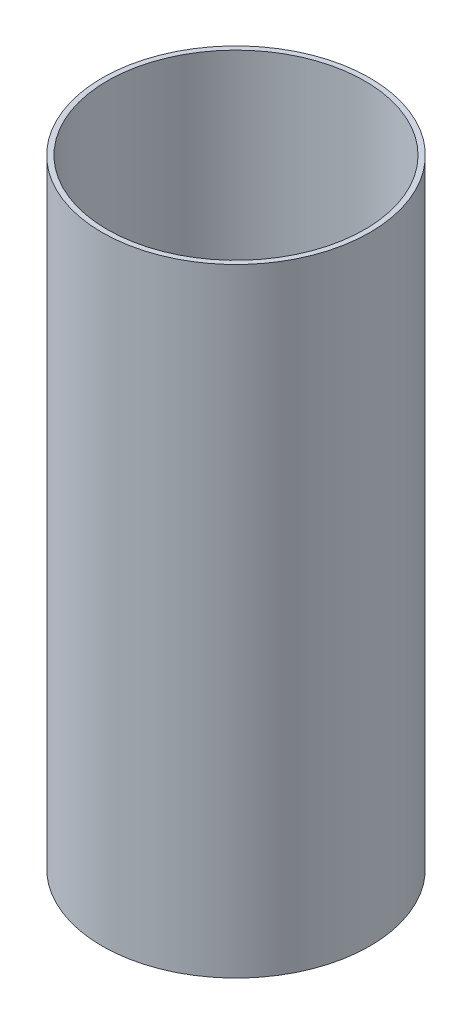
ISO-10303-21;
HEADER;
FILE_DESCRIPTION(('STEP AP214'),'2;1');
FILE_NAME('part.step','',(''),(''),'','','');
FILE_SCHEMA(('AUTOMOTIVE_DESIGN { 1 0 10303 214 1 1 1 1 }'));
ENDSEC;
DATA;
#1=APPLICATION_CONTEXT('core data for automotive mechanical design processes');
#2=APPLICATION_PROTOCOL_DEFINITION('international standard','automotive_design',2000,#1);
#3=PRODUCT_CONTEXT('',#1,'mechanical');
#4=PRODUCT('Part','Part','',(#3));
#5=PRODUCT_RELATED_PRODUCT_CATEGORY('part','',(#4));
#6=PRODUCT_DEFINITION_FORMATION('','',#4);
#7=PRODUCT_DEFINITION_CONTEXT('part definition',#1,'design');
#8=PRODUCT_DEFINITION('design','',#6,#7);
#9=PRODUCT_DEFINITION_SHAPE('','',#8);
#10=(LENGTH_UNIT() NAMED_UNIT(*) SI_UNIT(.MILLI.,.METRE.));
#11=(NAMED_UNIT(*) PLANE_ANGLE_UNIT() SI_UNIT($,.RADIAN.));
#12=(NAMED_UNIT(*) SI_UNIT($,.STERADIAN.) SOLID_ANGLE_UNIT());
#13=UNCERTAINTY_MEASURE_WITH_UNIT(LENGTH_MEASURE(1.E-05),#10,'distance_accuracy_value','');
#14=(GEOMETRIC_REPRESENTATION_CONTEXT(3) GLOBAL_UNCERTAINTY_ASSIGNED_CONTEXT((#13)) GLOBAL_UNIT_ASSIGNED_CONTEXT((#10,
#11,#12)) REPRESENTATION_CONTEXT('',''));
#15=CARTESIAN_POINT('',(0.,0.,0.));
#16=DIRECTION('',(0.,0.,1.));
#17=DIRECTION('',(1.,0.,0.));
#18=AXIS2_PLACEMENT_3D('',#15,#16,#17);
#19=CARTESIAN_POINT('',(0.,120.,0.));
#20=DIRECTION('',(0.,1.,0.));
#21=DIRECTION('',(0.,0.,1.));
#22=AXIS2_PLACEMENT_3D('',#19,#20,#21);
#23=PLANE('',#22);
#24=CARTESIAN_POINT('',(0.,120.,0.));
#25=DIRECTION('',(0.,1.,0.));
#26=DIRECTION('',(0.,0.,1.));
#27=AXIS2_PLACEMENT_3D('',#24,#25,#26);
#28=CIRCLE('',#27,26.);
#29=CARTESIAN_POINT('',(0.,120.,26.));
#30=VERTEX_POINT('',#29);
#31=EDGE_CURVE('E11',#30,#30,#28,.T.);
#32=ORIENTED_EDGE('',*,*,#31,.T.);
#33=EDGE_LOOP('',(#32));
#34=FACE_BOUND('',#33,.T.);
#35=CARTESIAN_POINT('',(0.,120.,0.));
#36=DIRECTION('',(0.,1.,0.));
#37=DIRECTION('',(0.,0.,1.));
#38=AXIS2_PLACEMENT_3D('',#35,#36,#37);
#39=CIRCLE('',#38,25.);
#40=CARTESIAN_POINT('',(0.,120.,25.));
#41=VERTEX_POINT('',#40);
#42=EDGE_CURVE('E53',#41,#41,#39,.T.);
#43=ORIENTED_EDGE('',*,*,#42,.F.);
#44=EDGE_LOOP('',(#43));
#45=FACE_BOUND('',#44,.T.);
#46=ADVANCED_FACE('F40',(#34,#45),#23,.T.);
#47=CARTESIAN_POINT('',(0.,0.,0.));
#48=DIRECTION('',(0.,1.,0.));
#49=DIRECTION('',(0.,0.,1.));
#50=AXIS2_PLACEMENT_3D('',#47,#48,#49);
#51=PLANE('',#50);
#52=CARTESIAN_POINT('',(0.,0.,0.));
#53=DIRECTION('',(0.,1.,0.));
#54=DIRECTION('',(0.,0.,1.));
#55=AXIS2_PLACEMENT_3D('',#52,#53,#54);
#56=CIRCLE('',#55,26.);
#57=CARTESIAN_POINT('',(0.,0.,26.));
#58=VERTEX_POINT('',#57);
#59=EDGE_CURVE('E44',#58,#58,#56,.T.);
#60=ORIENTED_EDGE('',*,*,#59,.F.);
#61=EDGE_LOOP('',(#60));
#62=FACE_BOUND('',#61,.T.);
#63=CARTESIAN_POINT('',(0.,0.,0.));
#64=DIRECTION('',(0.,1.,0.));
#65=DIRECTION('',(0.,0.,1.));
#66=AXIS2_PLACEMENT_3D('',#63,#64,#65);
#67=CIRCLE('',#66,25.);
#68=CARTESIAN_POINT('',(0.,0.,25.));
#69=VERTEX_POINT('',#68);
#70=EDGE_CURVE('E55',#69,#69,#67,.T.);
#71=ORIENTED_EDGE('',*,*,#70,.T.);
#72=EDGE_LOOP('',(#71));
#73=FACE_BOUND('',#72,.T.);
#74=ADVANCED_FACE('F65',(#62,#73),#51,.F.);
#75=CARTESIAN_POINT('',(0.,120.,0.));
#76=DIRECTION('',(0.,-1.,0.));
#77=DIRECTION('',(0.,0.,-1.));
#78=AXIS2_PLACEMENT_3D('',#75,#76,#77);
#79=CYLINDRICAL_SURFACE('',#78,26.);
#80=ORIENTED_EDGE('',*,*,#31,.F.);
#81=EDGE_LOOP('',(#80));
#82=FACE_BOUND('',#81,.T.);
#83=ORIENTED_EDGE('',*,*,#59,.T.);
#84=EDGE_LOOP('',(#83));
#85=FACE_BOUND('',#84,.T.);
#86=ADVANCED_FACE('F42',(#82,#85),#79,.T.);
#87=CARTESIAN_POINT('',(0.,120.,0.));
#88=DIRECTION('',(0.,-1.,0.));
#89=DIRECTION('',(0.,0.,-1.));
#90=AXIS2_PLACEMENT_3D('',#87,#88,#89);
#91=CYLINDRICAL_SURFACE('',#90,25.);
#92=ORIENTED_EDGE('',*,*,#42,.T.);
#93=EDGE_LOOP('',(#92));
#94=FACE_BOUND('',#93,.T.);
#95=ORIENTED_EDGE('',*,*,#70,.F.);
#96=EDGE_LOOP('',(#95));
#97=FACE_BOUND('',#96,.T.);
#98=ADVANCED_FACE('F61',(#94,#97),#91,.F.);
#99=CLOSED_SHELL('',(#46,#74,#86,#98));
#100=MANIFOLD_SOLID_BREP('B2',#99);
#101=ADVANCED_BREP_SHAPE_REPRESENTATION('',(#18,#100),#14);
#102=SHAPE_DEFINITION_REPRESENTATION(#9,#101);
ENDSEC;
END-ISO-10303-21;
